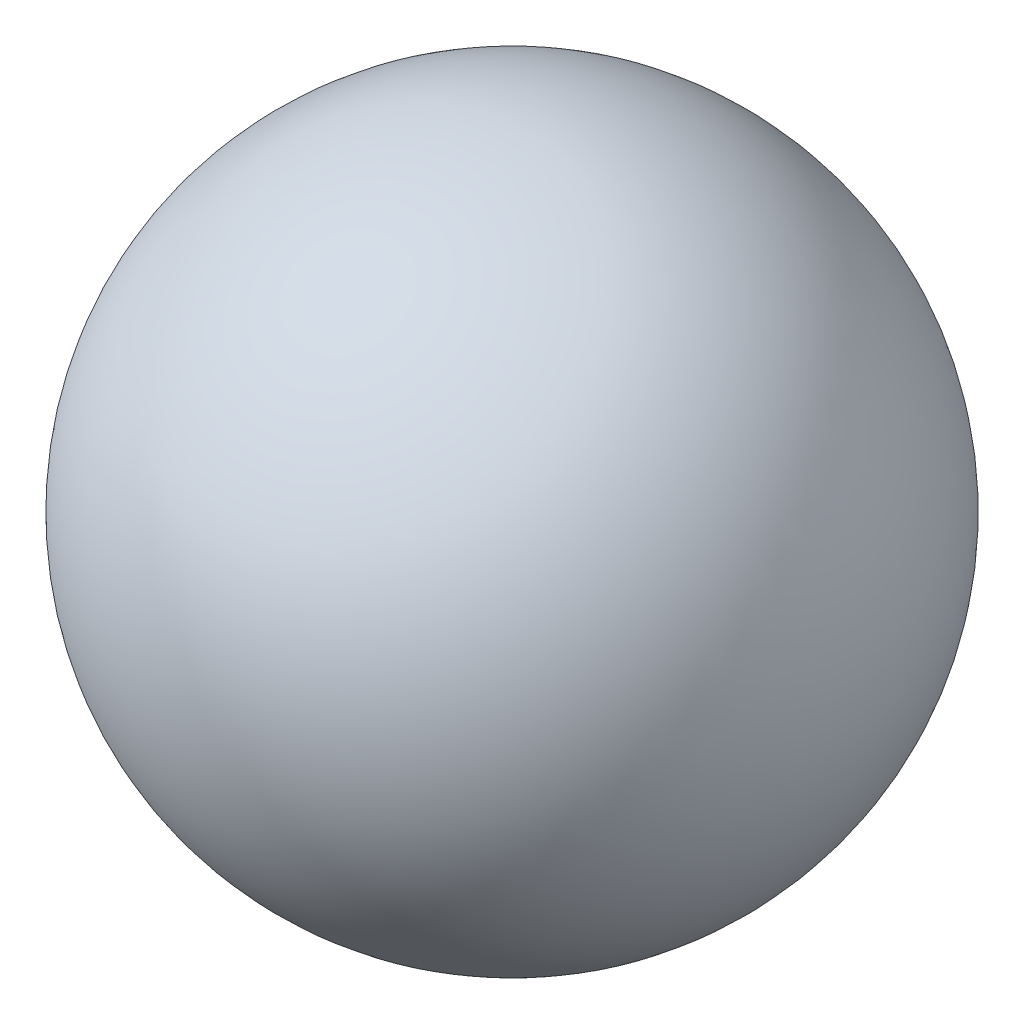
ISO-10303-21;
HEADER;
FILE_DESCRIPTION(('STEP AP214'),'2;1');
FILE_NAME('part.step','',(''),(''),'','','');
FILE_SCHEMA(('AUTOMOTIVE_DESIGN { 1 0 10303 214 1 1 1 1 }'));
ENDSEC;
DATA;
#1=APPLICATION_CONTEXT('core data for automotive mechanical design processes');
#2=APPLICATION_PROTOCOL_DEFINITION('international standard','automotive_design',2000,#1);
#3=PRODUCT_CONTEXT('',#1,'mechanical');
#4=PRODUCT('Part','Part','',(#3));
#5=PRODUCT_RELATED_PRODUCT_CATEGORY('part','',(#4));
#6=PRODUCT_DEFINITION_FORMATION('','',#4);
#7=PRODUCT_DEFINITION_CONTEXT('part definition',#1,'design');
#8=PRODUCT_DEFINITION('design','',#6,#7);
#9=PRODUCT_DEFINITION_SHAPE('','',#8);
#10=(LENGTH_UNIT() NAMED_UNIT(*) SI_UNIT(.MILLI.,.METRE.));
#11=(NAMED_UNIT(*) PLANE_ANGLE_UNIT() SI_UNIT($,.RADIAN.));
#12=(NAMED_UNIT(*) SI_UNIT($,.STERADIAN.) SOLID_ANGLE_UNIT());
#13=UNCERTAINTY_MEASURE_WITH_UNIT(LENGTH_MEASURE(1.E-05),#10,'distance_accuracy_value','');
#14=(GEOMETRIC_REPRESENTATION_CONTEXT(3) GLOBAL_UNCERTAINTY_ASSIGNED_CONTEXT((#13)) GLOBAL_UNIT_ASSIGNED_CONTEXT((#10,
#11,#12)) REPRESENTATION_CONTEXT('',''));
#15=CARTESIAN_POINT('',(0.,0.,0.));
#16=DIRECTION('',(0.,0.,1.));
#17=DIRECTION('',(1.,0.,0.));
#18=AXIS2_PLACEMENT_3D('',#15,#16,#17);
#19=CARTESIAN_POINT('',(0.,0.,0.));
#20=DIRECTION('',(0.,1.,0.));
#21=DIRECTION('',(1.,0.,0.));
#22=AXIS2_PLACEMENT_3D('',#19,#20,#21);
#23=SPHERICAL_SURFACE('',#22,21.31);
#24=CARTESIAN_POINT('',(0.,21.31,0.));
#25=VERTEX_POINT('',#24);
#26=VERTEX_LOOP('',#25);
#27=FACE_BOUND('',#26,.T.);
#28=ADVANCED_FACE('F32',(#27),#23,.T.);
#29=CLOSED_SHELL('',(#28));
#30=MANIFOLD_SOLID_BREP('B2',#29);
#31=ADVANCED_BREP_SHAPE_REPRESENTATION('',(#18,#30),#14);
#32=SHAPE_DEFINITION_REPRESENTATION(#9,#31);
ENDSEC;
END-ISO-10303-21;
